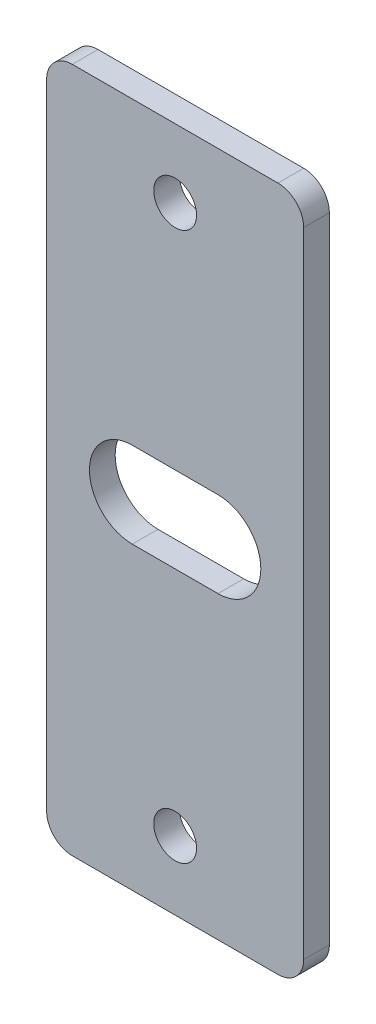
ISO-10303-21;
HEADER;
FILE_DESCRIPTION(('STEP AP214'),'2;1');
FILE_NAME('part.step','',(''),(''),'','','');
FILE_SCHEMA(('AUTOMOTIVE_DESIGN { 1 0 10303 214 1 1 1 1 }'));
ENDSEC;
DATA;
#1=APPLICATION_CONTEXT('core data for automotive mechanical design processes');
#2=APPLICATION_PROTOCOL_DEFINITION('international standard','automotive_design',2000,#1);
#3=PRODUCT_CONTEXT('',#1,'mechanical');
#4=PRODUCT('Part','Part','',(#3));
#5=PRODUCT_RELATED_PRODUCT_CATEGORY('part','',(#4));
#6=PRODUCT_DEFINITION_FORMATION('','',#4);
#7=PRODUCT_DEFINITION_CONTEXT('part definition',#1,'design');
#8=PRODUCT_DEFINITION('design','',#6,#7);
#9=PRODUCT_DEFINITION_SHAPE('','',#8);
#10=(LENGTH_UNIT() NAMED_UNIT(*) SI_UNIT(.MILLI.,.METRE.));
#11=(NAMED_UNIT(*) PLANE_ANGLE_UNIT() SI_UNIT($,.RADIAN.));
#12=(NAMED_UNIT(*) SI_UNIT($,.STERADIAN.) SOLID_ANGLE_UNIT());
#13=UNCERTAINTY_MEASURE_WITH_UNIT(LENGTH_MEASURE(1.E-05),#10,'distance_accuracy_value','');
#14=(GEOMETRIC_REPRESENTATION_CONTEXT(3) GLOBAL_UNCERTAINTY_ASSIGNED_CONTEXT((#13)) GLOBAL_UNIT_ASSIGNED_CONTEXT((#10,
#11,#12)) REPRESENTATION_CONTEXT('',''));
#15=CARTESIAN_POINT('',(0.,0.,0.));
#16=DIRECTION('',(0.,0.,1.));
#17=DIRECTION('',(1.,0.,0.));
#18=AXIS2_PLACEMENT_3D('',#15,#16,#17);
#19=CARTESIAN_POINT('',(-12.,3.,3.));
#20=DIRECTION('',(0.,0.,1.));
#21=DIRECTION('',(1.,0.,0.));
#22=AXIS2_PLACEMENT_3D('',#19,#20,#21);
#23=PLANE('',#22);
#24=CARTESIAN_POINT('',(0.,72.,3.));
#25=DIRECTION('',(0.,0.,1.));
#26=DIRECTION('',(1.,0.,0.));
#27=AXIS2_PLACEMENT_3D('',#24,#25,#26);
#28=CIRCLE('',#27,2.5);
#29=CARTESIAN_POINT('',(2.5,72.,3.));
#30=VERTEX_POINT('',#29);
#31=EDGE_CURVE('E174',#30,#30,#28,.T.);
#32=ORIENTED_EDGE('',*,*,#31,.F.);
#33=EDGE_LOOP('',(#32));
#34=FACE_BOUND('',#33,.T.);
#35=CARTESIAN_POINT('',(-12.,3.,3.));
#36=DIRECTION('',(0.,0.,1.));
#37=DIRECTION('',(1.,0.,0.));
#38=AXIS2_PLACEMENT_3D('',#35,#36,#37);
#39=CIRCLE('',#38,3.);
#40=CARTESIAN_POINT('',(-15.,3.,3.));
#41=VERTEX_POINT('',#40);
#42=CARTESIAN_POINT('',(-12.,0.,3.));
#43=VERTEX_POINT('',#42);
#44=EDGE_CURVE('E185',#41,#43,#39,.T.);
#45=ORIENTED_EDGE('',*,*,#44,.T.);
#46=DIRECTION('',(1.,0.,0.));
#47=VECTOR('',#46,1.);
#48=CARTESIAN_POINT('',(-12.,0.,3.));
#49=LINE('',#48,#47);
#50=CARTESIAN_POINT('',(12.,0.,3.));
#51=VERTEX_POINT('',#50);
#52=EDGE_CURVE('E189',#43,#51,#49,.T.);
#53=ORIENTED_EDGE('',*,*,#52,.T.);
#54=CARTESIAN_POINT('',(12.,3.,3.));
#55=DIRECTION('',(0.,0.,1.));
#56=DIRECTION('',(1.,0.,0.));
#57=AXIS2_PLACEMENT_3D('',#54,#55,#56);
#58=CIRCLE('',#57,3.);
#59=CARTESIAN_POINT('',(15.,3.,3.));
#60=VERTEX_POINT('',#59);
#61=EDGE_CURVE('E192',#51,#60,#58,.T.);
#62=ORIENTED_EDGE('',*,*,#61,.T.);
#63=DIRECTION('',(0.,1.,0.));
#64=VECTOR('',#63,1.);
#65=CARTESIAN_POINT('',(15.,3.,3.));
#66=LINE('',#65,#64);
#67=CARTESIAN_POINT('',(15.,77.,3.));
#68=VERTEX_POINT('',#67);
#69=EDGE_CURVE('E195',#60,#68,#66,.T.);
#70=ORIENTED_EDGE('',*,*,#69,.T.);
#71=CARTESIAN_POINT('',(12.,77.,3.));
#72=DIRECTION('',(0.,0.,1.));
#73=DIRECTION('',(1.,0.,0.));
#74=AXIS2_PLACEMENT_3D('',#71,#72,#73);
#75=CIRCLE('',#74,3.);
#76=CARTESIAN_POINT('',(12.,80.,3.));
#77=VERTEX_POINT('',#76);
#78=EDGE_CURVE('E198',#68,#77,#75,.T.);
#79=ORIENTED_EDGE('',*,*,#78,.T.);
#80=DIRECTION('',(-1.,0.,0.));
#81=VECTOR('',#80,1.);
#82=CARTESIAN_POINT('',(12.,80.,3.));
#83=LINE('',#82,#81);
#84=CARTESIAN_POINT('',(-12.,80.,3.));
#85=VERTEX_POINT('',#84);
#86=EDGE_CURVE('E201',#77,#85,#83,.T.);
#87=ORIENTED_EDGE('',*,*,#86,.T.);
#88=CARTESIAN_POINT('',(-12.,77.,3.));
#89=DIRECTION('',(0.,0.,1.));
#90=DIRECTION('',(1.,0.,0.));
#91=AXIS2_PLACEMENT_3D('',#88,#89,#90);
#92=CIRCLE('',#91,3.);
#93=CARTESIAN_POINT('',(-15.,77.,3.));
#94=VERTEX_POINT('',#93);
#95=EDGE_CURVE('E204',#85,#94,#92,.T.);
#96=ORIENTED_EDGE('',*,*,#95,.T.);
#97=DIRECTION('',(0.,-1.,0.));
#98=VECTOR('',#97,1.);
#99=CARTESIAN_POINT('',(-15.,77.,3.));
#100=LINE('',#99,#98);
#101=EDGE_CURVE('E207',#94,#41,#100,.T.);
#102=ORIENTED_EDGE('',*,*,#101,.T.);
#103=EDGE_LOOP('',(#45,#53,#62,#70,#79,#87,#96,#102));
#104=FACE_BOUND('',#103,.T.);
#105=DIRECTION('',(1.,0.,0.));
#106=VECTOR('',#105,1.);
#107=CARTESIAN_POINT('',(-5.,35.,3.));
#108=LINE('',#107,#106);
#109=CARTESIAN_POINT('',(-5.,35.,3.));
#110=VERTEX_POINT('',#109);
#111=CARTESIAN_POINT('',(5.,35.,3.));
#112=VERTEX_POINT('',#111);
#113=EDGE_CURVE('E180',#110,#112,#108,.T.);
#114=ORIENTED_EDGE('',*,*,#113,.F.);
#115=CARTESIAN_POINT('',(-5.00000000000001,40.,3.));
#116=DIRECTION('',(0.,0.,1.));
#117=DIRECTION('',(1.,0.,0.));
#118=AXIS2_PLACEMENT_3D('',#115,#116,#117);
#119=CIRCLE('',#118,5.);
#120=CARTESIAN_POINT('',(-5.,45.,3.));
#121=VERTEX_POINT('',#120);
#122=EDGE_CURVE('E160',#121,#110,#119,.T.);
#123=ORIENTED_EDGE('',*,*,#122,.F.);
#124=DIRECTION('',(-1.,0.,0.));
#125=VECTOR('',#124,1.);
#126=CARTESIAN_POINT('',(5.,45.,3.));
#127=LINE('',#126,#125);
#128=CARTESIAN_POINT('',(5.,45.,3.));
#129=VERTEX_POINT('',#128);
#130=EDGE_CURVE('E175',#129,#121,#127,.T.);
#131=ORIENTED_EDGE('',*,*,#130,.F.);
#132=CARTESIAN_POINT('',(5.00000000000001,40.,3.));
#133=DIRECTION('',(0.,0.,1.));
#134=DIRECTION('',(1.,0.,0.));
#135=AXIS2_PLACEMENT_3D('',#132,#133,#134);
#136=CIRCLE('',#135,5.);
#137=EDGE_CURVE('E149',#112,#129,#136,.T.);
#138=ORIENTED_EDGE('',*,*,#137,.F.);
#139=EDGE_LOOP('',(#114,#123,#131,#138));
#140=FACE_BOUND('',#139,.T.);
#141=CARTESIAN_POINT('',(0.,8.,3.));
#142=DIRECTION('',(0.,0.,1.));
#143=DIRECTION('',(1.,0.,0.));
#144=AXIS2_PLACEMENT_3D('',#141,#142,#143);
#145=CIRCLE('',#144,2.5);
#146=CARTESIAN_POINT('',(2.5,8.,3.));
#147=VERTEX_POINT('',#146);
#148=EDGE_CURVE('E216',#147,#147,#145,.T.);
#149=ORIENTED_EDGE('',*,*,#148,.F.);
#150=EDGE_LOOP('',(#149));
#151=FACE_BOUND('',#150,.T.);
#152=ADVANCED_FACE('F51',(#34,#104,#140,#151),#23,.T.);
#153=CARTESIAN_POINT('',(-12.,3.,0.));
#154=DIRECTION('',(0.,0.,1.));
#155=DIRECTION('',(1.,0.,0.));
#156=AXIS2_PLACEMENT_3D('',#153,#154,#155);
#157=PLANE('',#156);
#158=CARTESIAN_POINT('',(-12.,3.,0.));
#159=DIRECTION('',(0.,0.,1.));
#160=DIRECTION('',(1.,0.,0.));
#161=AXIS2_PLACEMENT_3D('',#158,#159,#160);
#162=CIRCLE('',#161,3.);
#163=CARTESIAN_POINT('',(-15.,3.,0.));
#164=VERTEX_POINT('',#163);
#165=CARTESIAN_POINT('',(-12.,0.,0.));
#166=VERTEX_POINT('',#165);
#167=EDGE_CURVE('E211',#164,#166,#162,.T.);
#168=ORIENTED_EDGE('',*,*,#167,.F.);
#169=DIRECTION('',(0.,-1.,0.));
#170=VECTOR('',#169,1.);
#171=CARTESIAN_POINT('',(-15.,77.,0.));
#172=LINE('',#171,#170);
#173=CARTESIAN_POINT('',(-15.,77.,0.));
#174=VERTEX_POINT('',#173);
#175=EDGE_CURVE('E190',#174,#164,#172,.T.);
#176=ORIENTED_EDGE('',*,*,#175,.F.);
#177=CARTESIAN_POINT('',(-12.,77.,0.));
#178=DIRECTION('',(0.,0.,1.));
#179=DIRECTION('',(1.,0.,0.));
#180=AXIS2_PLACEMENT_3D('',#177,#178,#179);
#181=CIRCLE('',#180,3.);
#182=CARTESIAN_POINT('',(-12.,80.,0.));
#183=VERTEX_POINT('',#182);
#184=EDGE_CURVE('E231',#183,#174,#181,.T.);
#185=ORIENTED_EDGE('',*,*,#184,.F.);
#186=DIRECTION('',(-1.,0.,0.));
#187=VECTOR('',#186,1.);
#188=CARTESIAN_POINT('',(12.,80.,0.));
#189=LINE('',#188,#187);
#190=CARTESIAN_POINT('',(12.,80.,0.));
#191=VERTEX_POINT('',#190);
#192=EDGE_CURVE('E228',#191,#183,#189,.T.);
#193=ORIENTED_EDGE('',*,*,#192,.F.);
#194=CARTESIAN_POINT('',(12.,77.,0.));
#195=DIRECTION('',(0.,0.,1.));
#196=DIRECTION('',(1.,0.,0.));
#197=AXIS2_PLACEMENT_3D('',#194,#195,#196);
#198=CIRCLE('',#197,3.);
#199=CARTESIAN_POINT('',(15.,77.,0.));
#200=VERTEX_POINT('',#199);
#201=EDGE_CURVE('E225',#200,#191,#198,.T.);
#202=ORIENTED_EDGE('',*,*,#201,.F.);
#203=DIRECTION('',(0.,1.,0.));
#204=VECTOR('',#203,1.);
#205=CARTESIAN_POINT('',(15.,3.,0.));
#206=LINE('',#205,#204);
#207=CARTESIAN_POINT('',(15.,3.,0.));
#208=VERTEX_POINT('',#207);
#209=EDGE_CURVE('E222',#208,#200,#206,.T.);
#210=ORIENTED_EDGE('',*,*,#209,.F.);
#211=CARTESIAN_POINT('',(12.,3.,0.));
#212=DIRECTION('',(0.,0.,1.));
#213=DIRECTION('',(1.,0.,0.));
#214=AXIS2_PLACEMENT_3D('',#211,#212,#213);
#215=CIRCLE('',#214,3.);
#216=CARTESIAN_POINT('',(12.,0.,0.));
#217=VERTEX_POINT('',#216);
#218=EDGE_CURVE('E219',#217,#208,#215,.T.);
#219=ORIENTED_EDGE('',*,*,#218,.F.);
#220=DIRECTION('',(1.,0.,0.));
#221=VECTOR('',#220,1.);
#222=CARTESIAN_POINT('',(-12.,0.,0.));
#223=LINE('',#222,#221);
#224=EDGE_CURVE('E215',#166,#217,#223,.T.);
#225=ORIENTED_EDGE('',*,*,#224,.F.);
#226=EDGE_LOOP('',(#168,#176,#185,#193,#202,#210,#219,#225));
#227=FACE_BOUND('',#226,.T.);
#228=CARTESIAN_POINT('',(-5.00000000000001,40.,0.));
#229=DIRECTION('',(0.,0.,1.));
#230=DIRECTION('',(1.,0.,0.));
#231=AXIS2_PLACEMENT_3D('',#228,#229,#230);
#232=CIRCLE('',#231,5.);
#233=CARTESIAN_POINT('',(-5.,45.,0.));
#234=VERTEX_POINT('',#233);
#235=CARTESIAN_POINT('',(-5.,35.,0.));
#236=VERTEX_POINT('',#235);
#237=EDGE_CURVE('E76',#234,#236,#232,.T.);
#238=ORIENTED_EDGE('',*,*,#237,.T.);
#239=DIRECTION('',(1.,0.,0.));
#240=VECTOR('',#239,1.);
#241=CARTESIAN_POINT('',(-5.,35.,0.));
#242=LINE('',#241,#240);
#243=CARTESIAN_POINT('',(5.,35.,0.));
#244=VERTEX_POINT('',#243);
#245=EDGE_CURVE('E164',#236,#244,#242,.T.);
#246=ORIENTED_EDGE('',*,*,#245,.T.);
#247=CARTESIAN_POINT('',(5.00000000000001,40.,0.));
#248=DIRECTION('',(0.,0.,1.));
#249=DIRECTION('',(1.,0.,0.));
#250=AXIS2_PLACEMENT_3D('',#247,#248,#249);
#251=CIRCLE('',#250,5.);
#252=CARTESIAN_POINT('',(5.,45.,0.));
#253=VERTEX_POINT('',#252);
#254=EDGE_CURVE('E146',#244,#253,#251,.T.);
#255=ORIENTED_EDGE('',*,*,#254,.T.);
#256=DIRECTION('',(-1.,0.,0.));
#257=VECTOR('',#256,1.);
#258=CARTESIAN_POINT('',(5.,45.,0.));
#259=LINE('',#258,#257);
#260=EDGE_CURVE('E156',#253,#234,#259,.T.);
#261=ORIENTED_EDGE('',*,*,#260,.T.);
#262=EDGE_LOOP('',(#238,#246,#255,#261));
#263=FACE_BOUND('',#262,.T.);
#264=CARTESIAN_POINT('',(0.,72.,0.));
#265=DIRECTION('',(0.,0.,1.));
#266=DIRECTION('',(1.,0.,0.));
#267=AXIS2_PLACEMENT_3D('',#264,#265,#266);
#268=CIRCLE('',#267,2.5);
#269=CARTESIAN_POINT('',(2.5,72.,0.));
#270=VERTEX_POINT('',#269);
#271=EDGE_CURVE('E491',#270,#270,#268,.T.);
#272=ORIENTED_EDGE('',*,*,#271,.T.);
#273=EDGE_LOOP('',(#272));
#274=FACE_BOUND('',#273,.T.);
#275=CARTESIAN_POINT('',(0.,8.,0.));
#276=DIRECTION('',(0.,0.,1.));
#277=DIRECTION('',(1.,0.,0.));
#278=AXIS2_PLACEMENT_3D('',#275,#276,#277);
#279=CIRCLE('',#278,2.5);
#280=CARTESIAN_POINT('',(2.5,8.,0.));
#281=VERTEX_POINT('',#280);
#282=EDGE_CURVE('E488',#281,#281,#279,.T.);
#283=ORIENTED_EDGE('',*,*,#282,.T.);
#284=EDGE_LOOP('',(#283));
#285=FACE_BOUND('',#284,.T.);
#286=ADVANCED_FACE('F162',(#227,#263,#274,#285),#157,.F.);
#287=CARTESIAN_POINT('',(-12.,3.,3.));
#288=DIRECTION('',(0.,0.,-1.));
#289=DIRECTION('',(-1.,0.,0.));
#290=AXIS2_PLACEMENT_3D('',#287,#288,#289);
#291=CYLINDRICAL_SURFACE('',#290,3.);
#292=ORIENTED_EDGE('',*,*,#167,.T.);
#293=DIRECTION('',(0.,0.,-1.));
#294=VECTOR('',#293,1.);
#295=CARTESIAN_POINT('',(-12.,0.,3.));
#296=LINE('',#295,#294);
#297=EDGE_CURVE('E11',#43,#166,#296,.T.);
#298=ORIENTED_EDGE('',*,*,#297,.F.);
#299=ORIENTED_EDGE('',*,*,#44,.F.);
#300=DIRECTION('',(0.,0.,-1.));
#301=VECTOR('',#300,1.);
#302=CARTESIAN_POINT('',(-15.,3.,3.));
#303=LINE('',#302,#301);
#304=EDGE_CURVE('E210',#41,#164,#303,.T.);
#305=ORIENTED_EDGE('',*,*,#304,.T.);
#306=EDGE_LOOP('',(#292,#298,#299,#305));
#307=FACE_BOUND('',#306,.T.);
#308=ADVANCED_FACE('F54',(#307),#291,.T.);
#309=CARTESIAN_POINT('',(-12.,0.,3.));
#310=DIRECTION('',(0.,1.,0.));
#311=DIRECTION('',(0.,0.,1.));
#312=AXIS2_PLACEMENT_3D('',#309,#310,#311);
#313=PLANE('',#312);
#314=ORIENTED_EDGE('',*,*,#224,.T.);
#315=DIRECTION('',(0.,0.,-1.));
#316=VECTOR('',#315,1.);
#317=CARTESIAN_POINT('',(12.,0.,3.));
#318=LINE('',#317,#316);
#319=EDGE_CURVE('E61',#51,#217,#318,.T.);
#320=ORIENTED_EDGE('',*,*,#319,.F.);
#321=ORIENTED_EDGE('',*,*,#52,.F.);
#322=ORIENTED_EDGE('',*,*,#297,.T.);
#323=EDGE_LOOP('',(#314,#320,#321,#322));
#324=FACE_BOUND('',#323,.T.);
#325=ADVANCED_FACE('F287',(#324),#313,.F.);
#326=CARTESIAN_POINT('',(12.,3.,3.));
#327=DIRECTION('',(0.,0.,-1.));
#328=DIRECTION('',(-1.,0.,0.));
#329=AXIS2_PLACEMENT_3D('',#326,#327,#328);
#330=CYLINDRICAL_SURFACE('',#329,3.);
#331=ORIENTED_EDGE('',*,*,#218,.T.);
#332=DIRECTION('',(0.,0.,-1.));
#333=VECTOR('',#332,1.);
#334=CARTESIAN_POINT('',(15.,3.,3.));
#335=LINE('',#334,#333);
#336=EDGE_CURVE('E255',#60,#208,#335,.T.);
#337=ORIENTED_EDGE('',*,*,#336,.F.);
#338=ORIENTED_EDGE('',*,*,#61,.F.);
#339=ORIENTED_EDGE('',*,*,#319,.T.);
#340=EDGE_LOOP('',(#331,#337,#338,#339));
#341=FACE_BOUND('',#340,.T.);
#342=ADVANCED_FACE('F265',(#341),#330,.T.);
#343=CARTESIAN_POINT('',(15.,3.,3.));
#344=DIRECTION('',(-1.,0.,0.));
#345=DIRECTION('',(0.,0.,1.));
#346=AXIS2_PLACEMENT_3D('',#343,#344,#345);
#347=PLANE('',#346);
#348=ORIENTED_EDGE('',*,*,#209,.T.);
#349=DIRECTION('',(0.,0.,-1.));
#350=VECTOR('',#349,1.);
#351=CARTESIAN_POINT('',(15.,77.,3.));
#352=LINE('',#351,#350);
#353=EDGE_CURVE('E251',#68,#200,#352,.T.);
#354=ORIENTED_EDGE('',*,*,#353,.F.);
#355=ORIENTED_EDGE('',*,*,#69,.F.);
#356=ORIENTED_EDGE('',*,*,#336,.T.);
#357=EDGE_LOOP('',(#348,#354,#355,#356));
#358=FACE_BOUND('',#357,.T.);
#359=ADVANCED_FACE('F275',(#358),#347,.F.);
#360=CARTESIAN_POINT('',(12.,77.,3.));
#361=DIRECTION('',(0.,0.,-1.));
#362=DIRECTION('',(-1.,0.,0.));
#363=AXIS2_PLACEMENT_3D('',#360,#361,#362);
#364=CYLINDRICAL_SURFACE('',#363,3.);
#365=ORIENTED_EDGE('',*,*,#201,.T.);
#366=DIRECTION('',(0.,0.,-1.));
#367=VECTOR('',#366,1.);
#368=CARTESIAN_POINT('',(12.,80.,3.));
#369=LINE('',#368,#367);
#370=EDGE_CURVE('E247',#77,#191,#369,.T.);
#371=ORIENTED_EDGE('',*,*,#370,.F.);
#372=ORIENTED_EDGE('',*,*,#78,.F.);
#373=ORIENTED_EDGE('',*,*,#353,.T.);
#374=EDGE_LOOP('',(#365,#371,#372,#373));
#375=FACE_BOUND('',#374,.T.);
#376=ADVANCED_FACE('F279',(#375),#364,.T.);
#377=CARTESIAN_POINT('',(12.,80.,3.));
#378=DIRECTION('',(0.,-1.,0.));
#379=DIRECTION('',(0.,0.,-1.));
#380=AXIS2_PLACEMENT_3D('',#377,#378,#379);
#381=PLANE('',#380);
#382=ORIENTED_EDGE('',*,*,#192,.T.);
#383=DIRECTION('',(0.,0.,-1.));
#384=VECTOR('',#383,1.);
#385=CARTESIAN_POINT('',(-12.,80.,3.));
#386=LINE('',#385,#384);
#387=EDGE_CURVE('E243',#85,#183,#386,.T.);
#388=ORIENTED_EDGE('',*,*,#387,.F.);
#389=ORIENTED_EDGE('',*,*,#86,.F.);
#390=ORIENTED_EDGE('',*,*,#370,.T.);
#391=EDGE_LOOP('',(#382,#388,#389,#390));
#392=FACE_BOUND('',#391,.T.);
#393=ADVANCED_FACE('F300',(#392),#381,.F.);
#394=CARTESIAN_POINT('',(-12.,77.,3.));
#395=DIRECTION('',(0.,0.,-1.));
#396=DIRECTION('',(-1.,0.,0.));
#397=AXIS2_PLACEMENT_3D('',#394,#395,#396);
#398=CYLINDRICAL_SURFACE('',#397,3.);
#399=ORIENTED_EDGE('',*,*,#184,.T.);
#400=DIRECTION('',(0.,0.,-1.));
#401=VECTOR('',#400,1.);
#402=CARTESIAN_POINT('',(-15.,77.,3.));
#403=LINE('',#402,#401);
#404=EDGE_CURVE('E239',#94,#174,#403,.T.);
#405=ORIENTED_EDGE('',*,*,#404,.F.);
#406=ORIENTED_EDGE('',*,*,#95,.F.);
#407=ORIENTED_EDGE('',*,*,#387,.T.);
#408=EDGE_LOOP('',(#399,#405,#406,#407));
#409=FACE_BOUND('',#408,.T.);
#410=ADVANCED_FACE('F298',(#409),#398,.T.);
#411=CARTESIAN_POINT('',(-15.,77.,3.));
#412=DIRECTION('',(1.,0.,0.));
#413=DIRECTION('',(0.,0.,-1.));
#414=AXIS2_PLACEMENT_3D('',#411,#412,#413);
#415=PLANE('',#414);
#416=ORIENTED_EDGE('',*,*,#175,.T.);
#417=ORIENTED_EDGE('',*,*,#304,.F.);
#418=ORIENTED_EDGE('',*,*,#101,.F.);
#419=ORIENTED_EDGE('',*,*,#404,.T.);
#420=EDGE_LOOP('',(#416,#417,#418,#419));
#421=FACE_BOUND('',#420,.T.);
#422=ADVANCED_FACE('F293',(#421),#415,.F.);
#423=CARTESIAN_POINT('',(-5.00000000000001,40.,3.));
#424=DIRECTION('',(0.,0.,-1.));
#425=DIRECTION('',(-1.,0.,0.));
#426=AXIS2_PLACEMENT_3D('',#423,#424,#425);
#427=CYLINDRICAL_SURFACE('',#426,5.);
#428=ORIENTED_EDGE('',*,*,#237,.F.);
#429=DIRECTION('',(0.,0.,-1.));
#430=VECTOR('',#429,1.);
#431=CARTESIAN_POINT('',(-5.,45.,3.));
#432=LINE('',#431,#430);
#433=EDGE_CURVE('E152',#121,#234,#432,.T.);
#434=ORIENTED_EDGE('',*,*,#433,.F.);
#435=ORIENTED_EDGE('',*,*,#122,.T.);
#436=DIRECTION('',(0.,0.,-1.));
#437=VECTOR('',#436,1.);
#438=CARTESIAN_POINT('',(-5.,35.,3.));
#439=LINE('',#438,#437);
#440=EDGE_CURVE('E502',#110,#236,#439,.T.);
#441=ORIENTED_EDGE('',*,*,#440,.T.);
#442=EDGE_LOOP('',(#428,#434,#435,#441));
#443=FACE_BOUND('',#442,.T.);
#444=ADVANCED_FACE('F326',(#443),#427,.F.);
#445=CARTESIAN_POINT('',(-5.,35.,3.));
#446=DIRECTION('',(0.,1.,0.));
#447=DIRECTION('',(0.,0.,1.));
#448=AXIS2_PLACEMENT_3D('',#445,#446,#447);
#449=PLANE('',#448);
#450=ORIENTED_EDGE('',*,*,#245,.F.);
#451=ORIENTED_EDGE('',*,*,#440,.F.);
#452=ORIENTED_EDGE('',*,*,#113,.T.);
#453=DIRECTION('',(0.,0.,-1.));
#454=VECTOR('',#453,1.);
#455=CARTESIAN_POINT('',(5.,35.,3.));
#456=LINE('',#455,#454);
#457=EDGE_CURVE('E153',#112,#244,#456,.T.);
#458=ORIENTED_EDGE('',*,*,#457,.T.);
#459=EDGE_LOOP('',(#450,#451,#452,#458));
#460=FACE_BOUND('',#459,.T.);
#461=ADVANCED_FACE('F423',(#460),#449,.T.);
#462=CARTESIAN_POINT('',(5.00000000000001,40.,3.));
#463=DIRECTION('',(0.,0.,-1.));
#464=DIRECTION('',(-1.,0.,0.));
#465=AXIS2_PLACEMENT_3D('',#462,#463,#464);
#466=CYLINDRICAL_SURFACE('',#465,5.);
#467=ORIENTED_EDGE('',*,*,#254,.F.);
#468=ORIENTED_EDGE('',*,*,#457,.F.);
#469=ORIENTED_EDGE('',*,*,#137,.T.);
#470=DIRECTION('',(0.,0.,-1.));
#471=VECTOR('',#470,1.);
#472=CARTESIAN_POINT('',(5.,45.,3.));
#473=LINE('',#472,#471);
#474=EDGE_CURVE('E68',#129,#253,#473,.T.);
#475=ORIENTED_EDGE('',*,*,#474,.T.);
#476=EDGE_LOOP('',(#467,#468,#469,#475));
#477=FACE_BOUND('',#476,.T.);
#478=ADVANCED_FACE('F143',(#477),#466,.F.);
#479=CARTESIAN_POINT('',(5.,45.,3.));
#480=DIRECTION('',(0.,-1.,0.));
#481=DIRECTION('',(0.,0.,-1.));
#482=AXIS2_PLACEMENT_3D('',#479,#480,#481);
#483=PLANE('',#482);
#484=ORIENTED_EDGE('',*,*,#260,.F.);
#485=ORIENTED_EDGE('',*,*,#474,.F.);
#486=ORIENTED_EDGE('',*,*,#130,.T.);
#487=ORIENTED_EDGE('',*,*,#433,.T.);
#488=EDGE_LOOP('',(#484,#485,#486,#487));
#489=FACE_BOUND('',#488,.T.);
#490=ADVANCED_FACE('F157',(#489),#483,.T.);
#491=CARTESIAN_POINT('',(0.,72.,3.));
#492=DIRECTION('',(0.,0.,-1.));
#493=DIRECTION('',(-1.,0.,0.));
#494=AXIS2_PLACEMENT_3D('',#491,#492,#493);
#495=CYLINDRICAL_SURFACE('',#494,2.5);
#496=ORIENTED_EDGE('',*,*,#31,.T.);
#497=EDGE_LOOP('',(#496));
#498=FACE_BOUND('',#497,.T.);
#499=ORIENTED_EDGE('',*,*,#271,.F.);
#500=EDGE_LOOP('',(#499));
#501=FACE_BOUND('',#500,.T.);
#502=ADVANCED_FACE('F453',(#498,#501),#495,.F.);
#503=CARTESIAN_POINT('',(0.,8.,3.));
#504=DIRECTION('',(0.,0.,-1.));
#505=DIRECTION('',(-1.,0.,0.));
#506=AXIS2_PLACEMENT_3D('',#503,#504,#505);
#507=CYLINDRICAL_SURFACE('',#506,2.5);
#508=ORIENTED_EDGE('',*,*,#148,.T.);
#509=EDGE_LOOP('',(#508));
#510=FACE_BOUND('',#509,.T.);
#511=ORIENTED_EDGE('',*,*,#282,.F.);
#512=EDGE_LOOP('',(#511));
#513=FACE_BOUND('',#512,.T.);
#514=ADVANCED_FACE('F463',(#510,#513),#507,.F.);
#515=CLOSED_SHELL('',(#152,#286,#308,#325,#342,#359,#376,#393,#410,#422,#444,#461,#478,#490,
#502,#514));
#516=MANIFOLD_SOLID_BREP('B2',#515);
#517=ADVANCED_BREP_SHAPE_REPRESENTATION('',(#18,#516),#14);
#518=SHAPE_DEFINITION_REPRESENTATION(#9,#517);
ENDSEC;
END-ISO-10303-21;
